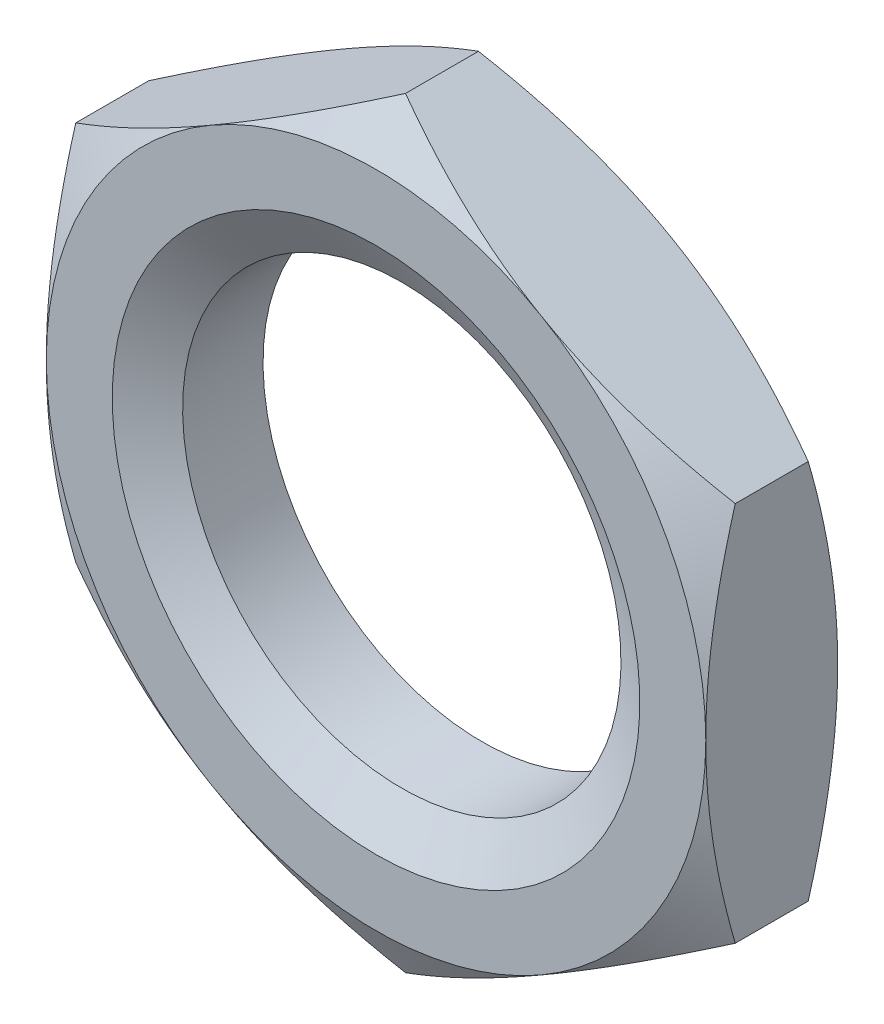
ISO-10303-21;
HEADER;
FILE_DESCRIPTION(('STEP AP214'),'2;1');
FILE_NAME('part.step','',(''),(''),'','','');
FILE_SCHEMA(('AUTOMOTIVE_DESIGN { 1 0 10303 214 1 1 1 1 }'));
ENDSEC;
DATA;
#1=APPLICATION_CONTEXT('core data for automotive mechanical design processes');
#2=APPLICATION_PROTOCOL_DEFINITION('international standard','automotive_design',2000,#1);
#3=PRODUCT_CONTEXT('',#1,'mechanical');
#4=PRODUCT('Part','Part','',(#3));
#5=PRODUCT_RELATED_PRODUCT_CATEGORY('part','',(#4));
#6=PRODUCT_DEFINITION_FORMATION('','',#4);
#7=PRODUCT_DEFINITION_CONTEXT('part definition',#1,'design');
#8=PRODUCT_DEFINITION('design','',#6,#7);
#9=PRODUCT_DEFINITION_SHAPE('','',#8);
#10=(LENGTH_UNIT() NAMED_UNIT(*) SI_UNIT(.MILLI.,.METRE.));
#11=(NAMED_UNIT(*) PLANE_ANGLE_UNIT() SI_UNIT($,.RADIAN.));
#12=(NAMED_UNIT(*) SI_UNIT($,.STERADIAN.) SOLID_ANGLE_UNIT());
#13=UNCERTAINTY_MEASURE_WITH_UNIT(LENGTH_MEASURE(1.E-05),#10,'distance_accuracy_value','');
#14=(GEOMETRIC_REPRESENTATION_CONTEXT(3) GLOBAL_UNCERTAINTY_ASSIGNED_CONTEXT((#13)) GLOBAL_UNIT_ASSIGNED_CONTEXT((#10,
#11,#12)) REPRESENTATION_CONTEXT('',''));
#15=CARTESIAN_POINT('',(0.,0.,0.));
#16=DIRECTION('',(0.,0.,1.));
#17=DIRECTION('',(1.,0.,0.));
#18=AXIS2_PLACEMENT_3D('',#15,#16,#17);
#19=CARTESIAN_POINT('',(5.,-2.88675134594813,2.));
#20=DIRECTION('',(-1.,0.,0.));
#21=DIRECTION('',(0.,-1.,0.));
#22=AXIS2_PLACEMENT_3D('',#19,#20,#21);
#23=PLANE('',#22);
#24=DIRECTION('',(0.,0.,-1.));
#25=VECTOR('',#24,1.);
#26=CARTESIAN_POINT('',(5.,2.88675134594813,2.));
#27=LINE('',#26,#25);
#28=CARTESIAN_POINT('',(5.,2.88675134594813,1.5534180126148));
#29=VERTEX_POINT('',#28);
#30=CARTESIAN_POINT('',(5.,2.88675134594813,0.446581987385198));
#31=VERTEX_POINT('',#30);
#32=EDGE_CURVE('E331',#29,#31,#27,.T.);
#33=ORIENTED_EDGE('',*,*,#32,.F.);
#34=CARTESIAN_POINT('',(5.,8.67769989901018,-0.895476469732144));
#35=CARTESIAN_POINT('',(5.,8.46999549957049,-0.79158832169301));
#36=CARTESIAN_POINT('',(5.,8.2619285715203,-0.688417367783481));
#37=CARTESIAN_POINT('',(5.,7.84490442766507,-0.483856435387872));
#38=CARTESIAN_POINT('',(5.,7.63594715329879,-0.382466576369758));
#39=CARTESIAN_POINT('',(5.,7.21658246207121,-0.181626132997501));
#40=CARTESIAN_POINT('',(5.,7.00617297083904,-0.082179870834344));
#41=CARTESIAN_POINT('',(5.,6.58413282248086,0.114080853981322));
#42=CARTESIAN_POINT('',(5.,6.3725021893705,0.210895368178843));
#43=CARTESIAN_POINT('',(5.,5.93822918094829,0.405568693651165));
#44=CARTESIAN_POINT('',(5.,5.71551978557234,0.503278490612934));
#45=CARTESIAN_POINT('',(5.,5.26820250921389,0.694246988771232));
#46=CARTESIAN_POINT('',(5.,5.04359469474663,0.787505845161429));
#47=CARTESIAN_POINT('',(5.,4.59223463012098,0.968324557950789));
#48=CARTESIAN_POINT('',(5.,4.36548370425789,1.05588769993605));
#49=CARTESIAN_POINT('',(5.,3.90933222338447,1.22378244712703));
#50=CARTESIAN_POINT('',(5.,3.67993196180089,1.30411484466863));
#51=CARTESIAN_POINT('',(5.,3.16390484606841,1.47329194440609));
#52=CARTESIAN_POINT('',(5.,2.87647211871412,1.55971587119509));
#53=CARTESIAN_POINT('',(5.,2.29642431473559,1.71355971006832));
#54=CARTESIAN_POINT('',(5.,2.00380970634483,1.78098132997756));
#55=CARTESIAN_POINT('',(5.,1.56391876076113,1.86312218276578));
#56=CARTESIAN_POINT('',(5.,1.4183757796473,1.8872097352011));
#57=CARTESIAN_POINT('',(5.,1.12635842901192,1.92878586653768));
#58=CARTESIAN_POINT('',(5.,0.979884197201779,1.94627539907545));
#59=CARTESIAN_POINT('',(5.,0.686297290424526,1.97413236405401));
#60=CARTESIAN_POINT('',(5.,0.539184811603695,1.98450184744371));
#61=CARTESIAN_POINT('',(5.,0.244620623595959,1.99779052304872));
#62=CARTESIAN_POINT('',(5.,0.0971689158377103,2.00070974658335));
#63=CARTESIAN_POINT('',(5.,-0.19857340257581,1.99899344261344));
#64=CARTESIAN_POINT('',(5.,-0.346863749180946,1.99431256971376));
#65=CARTESIAN_POINT('',(5.,-0.643014838668088,1.97747027318881));
#66=CARTESIAN_POINT('',(5.,-0.790875579638552,1.96530881632949));
#67=CARTESIAN_POINT('',(5.,-1.08589204232106,1.93389230888484));
#68=CARTESIAN_POINT('',(5.,-1.23304747583121,1.91463457364898));
#69=CARTESIAN_POINT('',(5.,-1.52634780050893,1.86959263924468));
#70=CARTESIAN_POINT('',(5.,-1.67249265612571,1.84380821166373));
#71=CARTESIAN_POINT('',(5.,-2.11408994754179,1.75668256988163));
#72=CARTESIAN_POINT('',(5.,-2.40773999823976,1.68613563774429));
#73=CARTESIAN_POINT('',(5.,-2.98996510032811,1.52649261863848));
#74=CARTESIAN_POINT('',(5.,-3.27853719879026,1.43738610188607));
#75=CARTESIAN_POINT('',(5.,-3.79024179461196,1.26587062387848));
#76=CARTESIAN_POINT('',(5.,-4.01425747334153,1.18605773283769));
#77=CARTESIAN_POINT('',(5.,-4.45972536136052,1.01978602799213));
#78=CARTESIAN_POINT('',(5.,-4.68117825700167,0.933329043298263));
#79=CARTESIAN_POINT('',(5.,-5.12210633953822,0.75511770374832));
#80=CARTESIAN_POINT('',(5.,-5.34158006915493,0.663359763856228));
#81=CARTESIAN_POINT('',(5.,-5.77874375147831,0.475684792649896));
#82=CARTESIAN_POINT('',(5.,-5.99643364762893,0.379767630070323));
#83=CARTESIAN_POINT('',(5.,-6.42115057108049,0.18872983291713));
#84=CARTESIAN_POINT('',(5.,-6.62823962150206,0.093746662021358));
#85=CARTESIAN_POINT('',(5.,-7.04125269120468,-0.0987070410129298));
#86=CARTESIAN_POINT('',(5.,-7.24717672850446,-0.196177534551979));
#87=CARTESIAN_POINT('',(5.,-7.65767872257996,-0.392988607314703));
#88=CARTESIAN_POINT('',(5.,-7.86225841752673,-0.492325568435463));
#89=CARTESIAN_POINT('',(5.,-8.27057470184742,-0.692704251624259));
#90=CARTESIAN_POINT('',(5.,-8.47431131456183,-0.793745926099248));
#91=CARTESIAN_POINT('',(5.,-8.67769989901018,-0.895476469732146));
#92=B_SPLINE_CURVE_WITH_KNOTS('',3,(#34,#35,#36,#37,#38,#39,#40,#41,#42,#43,#44,#45,#46,#47,#48,
#49,#50,#51,#52,#53,#54,#55,#56,#57,#58,#59,#60,#61,#62,#63,#64,#65,#66,#67,#68,#69,#70,#71,#72,
#73,#74,#75,#76,#77,#78,#79,#80,#81,#82,#83,#84,#85,#86,#87,#88,#89,#90,#91),.UNSPECIFIED.,.F.,
.F.,(4,2,2,2,2,2,2,2,2,2,2,2,2,2,2,2,2,2,2,2,2,2,2,2,2,2,2,2,4),(0.,0.69671365657365,
1.39347386853974,2.09163890900885,2.78979026545805,3.51935463562381,4.24889354901042,
4.9780078241473,5.70704210634685,6.60702023363349,7.50691744992126,7.94935972093775,
8.39173801959497,8.83398883650021,9.27623779427299,9.72113510626027,10.1660343948096,
10.6111021699031,11.0561855230418,11.9612951407397,12.8669147747757,13.58021856303,
14.2933266782871,15.0069228464768,15.720541552222,16.4040197454066,17.0874873384909,
17.7697443652452,18.4519823758207),.UNSPECIFIED.);
#93=CARTESIAN_POINT('',(5.,0.,2.));
#94=VERTEX_POINT('',#93);
#95=EDGE_CURVE('E12',#29,#94,#92,.T.);
#96=ORIENTED_EDGE('',*,*,#95,.T.);
#97=CARTESIAN_POINT('',(5.,-2.88675134594813,1.5534180126148));
#98=VERTEX_POINT('',#97);
#99=EDGE_CURVE('E43',#94,#98,#92,.T.);
#100=ORIENTED_EDGE('',*,*,#99,.T.);
#101=DIRECTION('',(0.,0.,-1.));
#102=VECTOR('',#101,1.);
#103=CARTESIAN_POINT('',(5.,-2.88675134594813,2.));
#104=LINE('',#103,#102);
#105=CARTESIAN_POINT('',(5.,-2.88675134594813,0.446581987385197));
#106=VERTEX_POINT('',#105);
#107=EDGE_CURVE('E332',#98,#106,#104,.T.);
#108=ORIENTED_EDGE('',*,*,#107,.T.);
#109=CARTESIAN_POINT('',(5.,-8.67769989901018,2.89547646973214));
#110=CARTESIAN_POINT('',(5.,-8.46999549957049,2.79158832169301));
#111=CARTESIAN_POINT('',(5.,-8.26192857152029,2.68841736778348));
#112=CARTESIAN_POINT('',(5.,-7.84490442766507,2.48385643538787));
#113=CARTESIAN_POINT('',(5.,-7.63594715329879,2.38246657636976));
#114=CARTESIAN_POINT('',(5.,-7.21658246207121,2.1816261329975));
#115=CARTESIAN_POINT('',(5.,-7.00617297083904,2.08217987083434));
#116=CARTESIAN_POINT('',(5.,-6.58413282248085,1.88591914601868));
#117=CARTESIAN_POINT('',(5.,-6.37250218937049,1.78910463182116));
#118=CARTESIAN_POINT('',(5.,-5.93822918094829,1.59443130634883));
#119=CARTESIAN_POINT('',(5.,-5.71551978557234,1.49672150938706));
#120=CARTESIAN_POINT('',(5.,-5.26820250921388,1.30575301122877));
#121=CARTESIAN_POINT('',(5.,-5.04359469474663,1.21249415483857));
#122=CARTESIAN_POINT('',(5.,-4.59223463012097,1.03167544204921));
#123=CARTESIAN_POINT('',(5.,-4.36548370425789,0.944112300063951));
#124=CARTESIAN_POINT('',(5.,-3.90933222338447,0.776217552872965));
#125=CARTESIAN_POINT('',(5.,-3.67993196180088,0.695885155331364));
#126=CARTESIAN_POINT('',(5.,-3.1639048460684,0.526708055593903));
#127=CARTESIAN_POINT('',(5.,-2.87647211871411,0.440284128804903));
#128=CARTESIAN_POINT('',(5.,-2.29642431473558,0.286440289931674));
#129=CARTESIAN_POINT('',(5.,-2.00380970634482,0.21901867002244));
#130=CARTESIAN_POINT('',(5.,-1.56391876076112,0.13687781723422));
#131=CARTESIAN_POINT('',(5.,-1.41837577964728,0.112790264798898));
#132=CARTESIAN_POINT('',(5.,-1.12635842901191,0.0712141334623172));
#133=CARTESIAN_POINT('',(5.,-0.979884197201768,0.0537246009245482));
#134=CARTESIAN_POINT('',(5.,-0.686297290424514,0.0258676359459865));
#135=CARTESIAN_POINT('',(5.,-0.539184811603682,0.0154981525562886));
#136=CARTESIAN_POINT('',(5.,-0.244620623595947,0.00220947695128381));
#137=CARTESIAN_POINT('',(5.,-0.097168915837698,-0.000709746583348257));
#138=CARTESIAN_POINT('',(5.,0.198573402575823,0.00100655738656429));
#139=CARTESIAN_POINT('',(5.,0.346863749180959,0.00568743028623774));
#140=CARTESIAN_POINT('',(5.,0.643014838668102,0.0225297268111923));
#141=CARTESIAN_POINT('',(5.,0.790875579638565,0.0346911836705058));
#142=CARTESIAN_POINT('',(5.,1.08589204232107,0.0661076911151592));
#143=CARTESIAN_POINT('',(5.,1.23304747583122,0.0853654263510177));
#144=CARTESIAN_POINT('',(5.,1.52634780050894,0.130407360755316));
#145=CARTESIAN_POINT('',(5.,1.67249265612572,0.156191788336271));
#146=CARTESIAN_POINT('',(5.,2.1140899475418,0.243317430118368));
#147=CARTESIAN_POINT('',(5.,2.40773999823977,0.31386436225571));
#148=CARTESIAN_POINT('',(5.,2.98996510032812,0.473507381361524));
#149=CARTESIAN_POINT('',(5.,3.27853719879027,0.562613898113936));
#150=CARTESIAN_POINT('',(5.,3.79024179461197,0.734129376121524));
#151=CARTESIAN_POINT('',(5.,4.01425747334154,0.813942267162311));
#152=CARTESIAN_POINT('',(5.,4.45972536136054,0.980213972007867));
#153=CARTESIAN_POINT('',(5.,4.68117825700168,1.06667095670174));
#154=CARTESIAN_POINT('',(5.,5.12210633953823,1.24488229625168));
#155=CARTESIAN_POINT('',(5.,5.34158006915494,1.33664023614377));
#156=CARTESIAN_POINT('',(5.,5.77874375147832,1.5243152073501));
#157=CARTESIAN_POINT('',(5.,5.99643364762893,1.62023236992968));
#158=CARTESIAN_POINT('',(5.,6.42115057108049,1.81127016708287));
#159=CARTESIAN_POINT('',(5.,6.62823962150206,1.90625333797864));
#160=CARTESIAN_POINT('',(5.,7.04125269120469,2.09870704101293));
#161=CARTESIAN_POINT('',(5.,7.24717672850447,2.19617753455198));
#162=CARTESIAN_POINT('',(5.,7.65767872257996,2.3929886073147));
#163=CARTESIAN_POINT('',(5.,7.86225841752673,2.49232556843546));
#164=CARTESIAN_POINT('',(5.,8.27057470184742,2.69270425162426));
#165=CARTESIAN_POINT('',(5.,8.47431131456183,2.79374592609924));
#166=CARTESIAN_POINT('',(5.,8.67769989901018,2.89547646973214));
#167=B_SPLINE_CURVE_WITH_KNOTS('',3,(#109,#110,#111,#112,#113,#114,#115,#116,#117,#118,#119,
#120,#121,#122,#123,#124,#125,#126,#127,#128,#129,#130,#131,#132,#133,#134,#135,#136,#137,#138,
#139,#140,#141,#142,#143,#144,#145,#146,#147,#148,#149,#150,#151,#152,#153,#154,#155,#156,#157,
#158,#159,#160,#161,#162,#163,#164,#165,#166),.UNSPECIFIED.,.F.,.F.,(4,2,2,2,2,2,2,2,2,2,2,2,2,
2,2,2,2,2,2,2,2,2,2,2,2,2,2,2,4),(0.,0.696713656573649,1.39347386853974,2.09163890900885,
2.78979026545805,3.51935463562382,4.24889354901043,4.97800782414731,5.70704210634685,
6.6070202336335,7.50691744992127,7.94935972093776,8.39173801959498,8.83398883650022,
9.276237794273,9.72113510626028,10.1660343948096,10.6111021699031,11.0561855230418,
11.9612951407398,12.8669147747757,13.58021856303,14.2933266782871,15.0069228464768,
15.720541552222,16.4040197454066,17.0874873384909,17.7697443652452,18.4519823758207),.UNSPECIFIED.);
#168=CARTESIAN_POINT('',(5.,0.,0.));
#169=VERTEX_POINT('',#168);
#170=EDGE_CURVE('E155',#106,#169,#167,.T.);
#171=ORIENTED_EDGE('',*,*,#170,.T.);
#172=EDGE_CURVE('E200',#169,#31,#167,.T.);
#173=ORIENTED_EDGE('',*,*,#172,.T.);
#174=EDGE_LOOP('',(#33,#96,#100,#108,#171,#173));
#175=FACE_BOUND('',#174,.T.);
#176=ADVANCED_FACE('F38',(#175),#23,.F.);
#177=CARTESIAN_POINT('',(0.,-5.77350269189626,2.));
#178=DIRECTION('',(-0.5,0.866025403784439,0.));
#179=DIRECTION('',(-0.866025403784439,-0.5,0.));
#180=AXIS2_PLACEMENT_3D('',#177,#178,#179);
#181=PLANE('',#180);
#182=ORIENTED_EDGE('',*,*,#107,.F.);
#183=CARTESIAN_POINT('',(5.0002,-2.88663587589429,1.55335134394817));
#184=CARTESIAN_POINT('',(4.78046540547482,-3.01349970319368,1.62661343236237));
#185=CARTESIAN_POINT('',(4.55885141554042,-3.14144859993849,1.69324867808191));
#186=CARTESIAN_POINT('',(4.11178600454649,-3.39956193532121,1.80956100898919));
#187=CARTESIAN_POINT('',(3.88632664040923,-3.52973095989718,1.85919695008421));
#188=CARTESIAN_POINT('',(3.43816769477649,-3.78847564779797,1.9364489745813));
#189=CARTESIAN_POINT('',(3.21553790689581,-3.91701101576052,1.96457962171651));
#190=CARTESIAN_POINT('',(2.88081009815336,-4.11026620624322,1.98980507804632));
#191=CARTESIAN_POINT('',(2.76915780319494,-4.17472868879311,1.99538654023052));
#192=CARTESIAN_POINT('',(2.5457500293262,-4.30371322717528,2.00079778324853));
#193=CARTESIAN_POINT('',(2.43399455370969,-4.36823528110589,2.0006277417418));
#194=CARTESIAN_POINT('',(2.12781576914936,-4.54500768479194,1.99224636820796));
#195=CARTESIAN_POINT('',(1.93349391403279,-4.65719946015292,1.97817022810275));
#196=CARTESIAN_POINT('',(1.5461398980023,-4.88083840557981,1.93353474289057));
#197=CARTESIAN_POINT('',(1.35310909862843,-4.9922847895602,1.90296013985249));
#198=CARTESIAN_POINT('',(0.964974657525146,-5.21637431361295,1.82653150637884));
#199=CARTESIAN_POINT('',(0.769920001358265,-5.32898917185759,1.78035362112132));
#200=CARTESIAN_POINT('',(0.382719654641233,-5.55253939626498,1.67554820550807));
#201=CARTESIAN_POINT('',(0.190569004591914,-5.66347762579592,1.61694529656263));
#202=CARTESIAN_POINT('',(-0.000199999999999114,-5.77361816195009,1.55335134394817));
#203=B_SPLINE_CURVE_WITH_KNOTS('',3,(#183,#184,#185,#186,#187,#188,#189,#190,#191,#192,#193,
#194,#195,#196,#197,#198,#199,#200,#201,#202),.UNSPECIFIED.,.F.,.F.,(4,2,2,2,2,2,2,2,2,4),(0.,
0.79255584136309,1.58701660053333,2.3618153748728,2.74884076077325,3.13585419177295,
3.80962362599679,4.48401723901189,5.17336882348928,5.86136694793725),.UNSPECIFIED.);
#204=CARTESIAN_POINT('',(2.5,-4.33012701892219,2.));
#205=VERTEX_POINT('',#204);
#206=EDGE_CURVE('E272',#98,#205,#203,.T.);
#207=ORIENTED_EDGE('',*,*,#206,.T.);
#208=CARTESIAN_POINT('',(0.,-5.77350269189626,1.5534180126148));
#209=VERTEX_POINT('',#208);
#210=EDGE_CURVE('E289',#205,#209,#203,.T.);
#211=ORIENTED_EDGE('',*,*,#210,.T.);
#212=DIRECTION('',(0.,0.,-1.));
#213=VECTOR('',#212,1.);
#214=CARTESIAN_POINT('',(0.,-5.77350269189626,2.));
#215=LINE('',#214,#213);
#216=CARTESIAN_POINT('',(0.,-5.77350269189626,0.446581987385197));
#217=VERTEX_POINT('',#216);
#218=EDGE_CURVE('E165',#209,#217,#215,.T.);
#219=ORIENTED_EDGE('',*,*,#218,.T.);
#220=CARTESIAN_POINT('',(-0.000199999999999318,-5.77361816195009,0.446648656051823));
#221=CARTESIAN_POINT('',(0.219534594525186,-5.6467543346507,0.373386567637629));
#222=CARTESIAN_POINT('',(0.441148584459581,-5.51880543790589,0.306751321918087));
#223=CARTESIAN_POINT('',(0.888213995453514,-5.26069210252318,0.190438991010807));
#224=CARTESIAN_POINT('',(1.11367335959077,-5.13052307794721,0.140803049915786));
#225=CARTESIAN_POINT('',(1.56183230522351,-4.87177839004641,0.0635510254186957));
#226=CARTESIAN_POINT('',(1.78446209310419,-4.74324302208387,0.0354203782834873));
#227=CARTESIAN_POINT('',(2.11918990184664,-4.54998783160116,0.0101949219536826));
#228=CARTESIAN_POINT('',(2.23084219680506,-4.48552534905128,0.00461345976948215));
#229=CARTESIAN_POINT('',(2.4542499706738,-4.35654081066911,-0.000797783248531316));
#230=CARTESIAN_POINT('',(2.56600544629031,-4.2920187567385,-0.000627741741797939));
#231=CARTESIAN_POINT('',(2.87218423085064,-4.11524635305244,0.00775363179203551));
#232=CARTESIAN_POINT('',(3.06650608596721,-4.00305457769146,0.0218297718972504));
#233=CARTESIAN_POINT('',(3.45386010199771,-3.77941563226457,0.0664652571094293));
#234=CARTESIAN_POINT('',(3.64689090137157,-3.66796924828418,0.0970398601475061));
#235=CARTESIAN_POINT('',(4.03502534247485,-3.44387972423144,0.173468493621161));
#236=CARTESIAN_POINT('',(4.23007999864174,-3.3312648659868,0.219646378878678));
#237=CARTESIAN_POINT('',(4.61728034535877,-3.1077146415794,0.324451794491931));
#238=CARTESIAN_POINT('',(4.80943099540809,-2.99677641204847,0.383054703437371));
#239=CARTESIAN_POINT('',(5.0002,-2.88663587589429,0.446648656051824));
#240=B_SPLINE_CURVE_WITH_KNOTS('',3,(#220,#221,#222,#223,#224,#225,#226,#227,#228,#229,#230,
#231,#232,#233,#234,#235,#236,#237,#238,#239),.UNSPECIFIED.,.F.,.F.,(4,2,2,2,2,2,2,2,2,4),(0.,
0.79255584136309,1.58701660053333,2.3618153748728,2.74884076077325,3.13585419177295,
3.80962362599679,4.48401723901189,5.17336882348928,5.86136694793725),.UNSPECIFIED.);
#241=CARTESIAN_POINT('',(2.5,-4.33012701892219,0.));
#242=VERTEX_POINT('',#241);
#243=EDGE_CURVE('E139',#217,#242,#240,.T.);
#244=ORIENTED_EDGE('',*,*,#243,.T.);
#245=EDGE_CURVE('E152',#242,#106,#240,.T.);
#246=ORIENTED_EDGE('',*,*,#245,.T.);
#247=EDGE_LOOP('',(#182,#207,#211,#219,#244,#246));
#248=FACE_BOUND('',#247,.T.);
#249=ADVANCED_FACE('F162',(#248),#181,.F.);
#250=CARTESIAN_POINT('',(-5.,-2.88675134594813,2.));
#251=DIRECTION('',(0.5,0.866025403784439,0.));
#252=DIRECTION('',(-0.866025403784439,0.5,0.));
#253=AXIS2_PLACEMENT_3D('',#250,#251,#252);
#254=PLANE('',#253);
#255=ORIENTED_EDGE('',*,*,#218,.F.);
#256=CARTESIAN_POINT('',(0.000200000000000734,-5.77361816195009,1.55335134394817));
#257=CARTESIAN_POINT('',(-0.219534594525185,-5.6467543346507,1.62661343236237));
#258=CARTESIAN_POINT('',(-0.44114858445958,-5.51880543790589,1.69324867808191));
#259=CARTESIAN_POINT('',(-0.888213995453512,-5.26069210252318,1.80956100898919));
#260=CARTESIAN_POINT('',(-1.11367335959077,-5.13052307794721,1.85919695008421));
#261=CARTESIAN_POINT('',(-1.56183230522351,-4.87177839004641,1.9364489745813));
#262=CARTESIAN_POINT('',(-1.78446209310419,-4.74324302208387,1.96457962171651));
#263=CARTESIAN_POINT('',(-2.11918990184664,-4.54998783160116,1.98980507804632));
#264=CARTESIAN_POINT('',(-2.23084219680506,-4.48552534905128,1.99538654023052));
#265=CARTESIAN_POINT('',(-2.4542499706738,-4.35654081066911,2.00079778324853));
#266=CARTESIAN_POINT('',(-2.56600544629031,-4.2920187567385,2.0006277417418));
#267=CARTESIAN_POINT('',(-2.87218423085064,-4.11524635305244,1.99224636820796));
#268=CARTESIAN_POINT('',(-3.06650608596721,-4.00305457769146,1.97817022810275));
#269=CARTESIAN_POINT('',(-3.4538601019977,-3.77941563226457,1.93353474289057));
#270=CARTESIAN_POINT('',(-3.64689090137157,-3.66796924828419,1.90296013985249));
#271=CARTESIAN_POINT('',(-4.03502534247485,-3.44387972423144,1.82653150637884));
#272=CARTESIAN_POINT('',(-4.23007999864173,-3.3312648659868,1.78035362112132));
#273=CARTESIAN_POINT('',(-4.61728034535877,-3.1077146415794,1.67554820550807));
#274=CARTESIAN_POINT('',(-4.80943099540809,-2.99677641204847,1.61694529656263));
#275=CARTESIAN_POINT('',(-5.0002,-2.88663587589429,1.55335134394817));
#276=B_SPLINE_CURVE_WITH_KNOTS('',3,(#256,#257,#258,#259,#260,#261,#262,#263,#264,#265,#266,
#267,#268,#269,#270,#271,#272,#273,#274,#275),.UNSPECIFIED.,.F.,.F.,(4,2,2,2,2,2,2,2,2,4),(0.,
0.79255584136309,1.58701660053333,2.3618153748728,2.74884076077325,3.13585419177295,
3.80962362599679,4.48401723901189,5.17336882348928,5.86136694793725),.UNSPECIFIED.);
#277=CARTESIAN_POINT('',(-2.5,-4.33012701892219,2.));
#278=VERTEX_POINT('',#277);
#279=EDGE_CURVE('E248',#209,#278,#276,.T.);
#280=ORIENTED_EDGE('',*,*,#279,.T.);
#281=CARTESIAN_POINT('',(-5.,-2.88675134594813,1.5534180126148));
#282=VERTEX_POINT('',#281);
#283=EDGE_CURVE('E296',#278,#282,#276,.T.);
#284=ORIENTED_EDGE('',*,*,#283,.T.);
#285=DIRECTION('',(0.,0.,-1.));
#286=VECTOR('',#285,1.);
#287=CARTESIAN_POINT('',(-5.,-2.88675134594813,2.));
#288=LINE('',#287,#286);
#289=CARTESIAN_POINT('',(-5.,-2.88675134594813,0.446581987385197));
#290=VERTEX_POINT('',#289);
#291=EDGE_CURVE('E336',#282,#290,#288,.T.);
#292=ORIENTED_EDGE('',*,*,#291,.T.);
#293=CARTESIAN_POINT('',(-5.0002,-2.88663587589429,0.446648656051824));
#294=CARTESIAN_POINT('',(-4.78046540547481,-3.01349970319368,0.373386567637631));
#295=CARTESIAN_POINT('',(-4.55885141554042,-3.14144859993849,0.306751321918088));
#296=CARTESIAN_POINT('',(-4.11178600454649,-3.39956193532121,0.190438991010808));
#297=CARTESIAN_POINT('',(-3.88632664040923,-3.52973095989718,0.140803049915787));
#298=CARTESIAN_POINT('',(-3.43816769477649,-3.78847564779797,0.0635510254186962));
#299=CARTESIAN_POINT('',(-3.21553790689581,-3.91701101576052,0.0354203782834877));
#300=CARTESIAN_POINT('',(-2.88081009815336,-4.11026620624322,0.0101949219536831));
#301=CARTESIAN_POINT('',(-2.76915780319494,-4.17472868879311,0.00461345976948265));
#302=CARTESIAN_POINT('',(-2.5457500293262,-4.30371322717528,-0.00079778324853101));
#303=CARTESIAN_POINT('',(-2.43399455370969,-4.36823528110589,-0.000627741741797893));
#304=CARTESIAN_POINT('',(-2.12781576914936,-4.54500768479194,0.00775363179203513));
#305=CARTESIAN_POINT('',(-1.93349391403279,-4.65719946015292,0.02182977189725));
#306=CARTESIAN_POINT('',(-1.5461398980023,-4.88083840557981,0.0664652571094285));
#307=CARTESIAN_POINT('',(-1.35310909862843,-4.9922847895602,0.097039860147505));
#308=CARTESIAN_POINT('',(-0.964974657525146,-5.21637431361295,0.17346849362116));
#309=CARTESIAN_POINT('',(-0.769920001358265,-5.32898917185759,0.219646378878676));
#310=CARTESIAN_POINT('',(-0.382719654641233,-5.55253939626498,0.32445179449193));
#311=CARTESIAN_POINT('',(-0.190569004591914,-5.66347762579591,0.383054703437369));
#312=CARTESIAN_POINT('',(0.000199999999999789,-5.77361816195009,0.446648656051822));
#313=B_SPLINE_CURVE_WITH_KNOTS('',3,(#293,#294,#295,#296,#297,#298,#299,#300,#301,#302,#303,
#304,#305,#306,#307,#308,#309,#310,#311,#312),.UNSPECIFIED.,.F.,.F.,(4,2,2,2,2,2,2,2,2,4),(0.,
0.79255584136309,1.58701660053333,2.3618153748728,2.74884076077325,3.13585419177295,
3.80962362599679,4.48401723901189,5.17336882348928,5.86136694793725),.UNSPECIFIED.);
#314=CARTESIAN_POINT('',(-2.5,-4.33012701892219,0.));
#315=VERTEX_POINT('',#314);
#316=EDGE_CURVE('E384',#290,#315,#313,.T.);
#317=ORIENTED_EDGE('',*,*,#316,.T.);
#318=EDGE_CURVE('E141',#315,#217,#313,.T.);
#319=ORIENTED_EDGE('',*,*,#318,.T.);
#320=EDGE_LOOP('',(#255,#280,#284,#292,#317,#319));
#321=FACE_BOUND('',#320,.T.);
#322=ADVANCED_FACE('F354',(#321),#254,.F.);
#323=CARTESIAN_POINT('',(-5.,2.88675134594813,2.));
#324=DIRECTION('',(1.,0.,0.));
#325=DIRECTION('',(0.,1.,0.));
#326=AXIS2_PLACEMENT_3D('',#323,#324,#325);
#327=PLANE('',#326);
#328=ORIENTED_EDGE('',*,*,#291,.F.);
#329=CARTESIAN_POINT('',(-5.,-8.67769989901018,-0.895476469732145));
#330=CARTESIAN_POINT('',(-5.,-8.46999549957049,-0.791588321693009));
#331=CARTESIAN_POINT('',(-5.,-8.26192857152029,-0.688417367783481));
#332=CARTESIAN_POINT('',(-5.,-7.84490442766506,-0.483856435387872));
#333=CARTESIAN_POINT('',(-5.,-7.63594715329879,-0.382466576369758));
#334=CARTESIAN_POINT('',(-5.,-7.2165824620712,-0.181626132997501));
#335=CARTESIAN_POINT('',(-5.,-7.00617297083904,-0.0821798708343445));
#336=CARTESIAN_POINT('',(-5.,-6.58413282248085,0.114080853981321));
#337=CARTESIAN_POINT('',(-5.,-6.37250218937049,0.210895368178842));
#338=CARTESIAN_POINT('',(-5.,-5.93822918094829,0.405568693651164));
#339=CARTESIAN_POINT('',(-5.,-5.71551978557234,0.503278490612933));
#340=CARTESIAN_POINT('',(-5.,-5.26820250921389,0.694246988771232));
#341=CARTESIAN_POINT('',(-5.,-5.04359469474663,0.787505845161428));
#342=CARTESIAN_POINT('',(-5.,-4.59223463012097,0.968324557950789));
#343=CARTESIAN_POINT('',(-5.,-4.36548370425789,1.05588769993605));
#344=CARTESIAN_POINT('',(-5.,-3.90933222338447,1.22378244712703));
#345=CARTESIAN_POINT('',(-5.,-3.67993196180089,1.30411484466863));
#346=CARTESIAN_POINT('',(-5.,-3.1639048460684,1.47329194440609));
#347=CARTESIAN_POINT('',(-5.,-2.87647211871411,1.55971587119509));
#348=CARTESIAN_POINT('',(-5.,-2.29642431473558,1.71355971006832));
#349=CARTESIAN_POINT('',(-5.,-2.00380970634482,1.78098132997756));
#350=CARTESIAN_POINT('',(-5.,-1.56391876076113,1.86312218276578));
#351=CARTESIAN_POINT('',(-5.,-1.41837577964729,1.8872097352011));
#352=CARTESIAN_POINT('',(-5.,-1.12635842901192,1.92878586653768));
#353=CARTESIAN_POINT('',(-5.,-0.979884197201775,1.94627539907545));
#354=CARTESIAN_POINT('',(-5.,-0.686297290424522,1.97413236405401));
#355=CARTESIAN_POINT('',(-5.,-0.539184811603691,1.98450184744371));
#356=CARTESIAN_POINT('',(-5.,-0.244620623595955,1.99779052304871));
#357=CARTESIAN_POINT('',(-5.,-0.0971689158377062,2.00070974658335));
#358=CARTESIAN_POINT('',(-5.,0.198573402575814,1.99899344261343));
#359=CARTESIAN_POINT('',(-5.,0.34686374918095,1.99431256971376));
#360=CARTESIAN_POINT('',(-5.,0.643014838668092,1.97747027318881));
#361=CARTESIAN_POINT('',(-5.,0.790875579638556,1.96530881632949));
#362=CARTESIAN_POINT('',(-5.,1.08589204232106,1.93389230888484));
#363=CARTESIAN_POINT('',(-5.,1.23304747583121,1.91463457364898));
#364=CARTESIAN_POINT('',(-5.,1.52634780050893,1.86959263924468));
#365=CARTESIAN_POINT('',(-5.,1.67249265612571,1.84380821166373));
#366=CARTESIAN_POINT('',(-5.,2.11408994754179,1.75668256988163));
#367=CARTESIAN_POINT('',(-5.,2.40773999823976,1.68613563774429));
#368=CARTESIAN_POINT('',(-5.,2.98996510032811,1.52649261863848));
#369=CARTESIAN_POINT('',(-5.,3.27853719879026,1.43738610188606));
#370=CARTESIAN_POINT('',(-5.,3.79024179461196,1.26587062387848));
#371=CARTESIAN_POINT('',(-5.,4.01425747334153,1.18605773283769));
#372=CARTESIAN_POINT('',(-5.,4.45972536136053,1.01978602799213));
#373=CARTESIAN_POINT('',(-5.,4.68117825700167,0.933329043298264));
#374=CARTESIAN_POINT('',(-5.,5.12210633953823,0.755117703748321));
#375=CARTESIAN_POINT('',(-5.,5.34158006915493,0.663359763856228));
#376=CARTESIAN_POINT('',(-5.,5.77874375147831,0.475684792649897));
#377=CARTESIAN_POINT('',(-5.,5.99643364762893,0.379767630070324));
#378=CARTESIAN_POINT('',(-5.,6.42115057108049,0.188729832917131));
#379=CARTESIAN_POINT('',(-5.,6.62823962150206,0.0937466620213591));
#380=CARTESIAN_POINT('',(-5.,7.04125269120468,-0.0987070410129277));
#381=CARTESIAN_POINT('',(-5.,7.24717672850446,-0.196177534551976));
#382=CARTESIAN_POINT('',(-5.,7.65767872257996,-0.3929886073147));
#383=CARTESIAN_POINT('',(-5.,7.86225841752672,-0.49232556843546));
#384=CARTESIAN_POINT('',(-5.,8.27057470184742,-0.692704251624256));
#385=CARTESIAN_POINT('',(-5.,8.47431131456183,-0.793745926099246));
#386=CARTESIAN_POINT('',(-5.,8.67769989901018,-0.895476469732144));
#387=B_SPLINE_CURVE_WITH_KNOTS('',3,(#329,#330,#331,#332,#333,#334,#335,#336,#337,#338,#339,
#340,#341,#342,#343,#344,#345,#346,#347,#348,#349,#350,#351,#352,#353,#354,#355,#356,#357,#358,
#359,#360,#361,#362,#363,#364,#365,#366,#367,#368,#369,#370,#371,#372,#373,#374,#375,#376,#377,
#378,#379,#380,#381,#382,#383,#384,#385,#386),.UNSPECIFIED.,.F.,.F.,(4,2,2,2,2,2,2,2,2,2,2,2,2,
2,2,2,2,2,2,2,2,2,2,2,2,2,2,2,4),(0.,0.69671365657365,1.39347386853974,2.09163890900885,
2.78979026545805,3.51935463562381,4.24889354901042,4.9780078241473,5.70704210634685,
6.60702023363349,7.50691744992126,7.94935972093775,8.39173801959497,8.83398883650021,
9.27623779427299,9.72113510626027,10.1660343948096,10.6111021699031,11.0561855230418,
11.9612951407397,12.8669147747757,13.58021856303,14.2933266782871,15.0069228464768,
15.720541552222,16.4040197454066,17.0874873384909,17.7697443652452,18.4519823758207),.UNSPECIFIED.);
#388=CARTESIAN_POINT('',(-5.,0.,2.));
#389=VERTEX_POINT('',#388);
#390=EDGE_CURVE('E302',#282,#389,#387,.T.);
#391=ORIENTED_EDGE('',*,*,#390,.T.);
#392=CARTESIAN_POINT('',(-5.,2.88675134594812,1.5534180126148));
#393=VERTEX_POINT('',#392);
#394=EDGE_CURVE('E254',#389,#393,#387,.T.);
#395=ORIENTED_EDGE('',*,*,#394,.T.);
#396=DIRECTION('',(0.,0.,-1.));
#397=VECTOR('',#396,1.);
#398=CARTESIAN_POINT('',(-5.,2.88675134594813,2.));
#399=LINE('',#398,#397);
#400=CARTESIAN_POINT('',(-5.,2.88675134594812,0.446581987385198));
#401=VERTEX_POINT('',#400);
#402=EDGE_CURVE('E309',#393,#401,#399,.T.);
#403=ORIENTED_EDGE('',*,*,#402,.T.);
#404=CARTESIAN_POINT('',(-5.,8.67769989901018,2.89547646973214));
#405=CARTESIAN_POINT('',(-5.,8.46999549957049,2.79158832169301));
#406=CARTESIAN_POINT('',(-5.,8.26192857152029,2.68841736778348));
#407=CARTESIAN_POINT('',(-5.,7.84490442766506,2.48385643538787));
#408=CARTESIAN_POINT('',(-5.,7.63594715329878,2.38246657636976));
#409=CARTESIAN_POINT('',(-5.,7.2165824620712,2.1816261329975));
#410=CARTESIAN_POINT('',(-5.,7.00617297083903,2.08217987083434));
#411=CARTESIAN_POINT('',(-5.,6.58413282248085,1.88591914601868));
#412=CARTESIAN_POINT('',(-5.,6.37250218937049,1.78910463182116));
#413=CARTESIAN_POINT('',(-5.,5.93822918094829,1.59443130634883));
#414=CARTESIAN_POINT('',(-5.,5.71551978557234,1.49672150938707));
#415=CARTESIAN_POINT('',(-5.,5.26820250921388,1.30575301122877));
#416=CARTESIAN_POINT('',(-5.,5.04359469474663,1.21249415483857));
#417=CARTESIAN_POINT('',(-5.,4.59223463012097,1.03167544204921));
#418=CARTESIAN_POINT('',(-5.,4.36548370425789,0.944112300063953));
#419=CARTESIAN_POINT('',(-5.,3.90933222338447,0.776217552872966));
#420=CARTESIAN_POINT('',(-5.,3.67993196180088,0.695885155331365));
#421=CARTESIAN_POINT('',(-5.,3.1639048460684,0.526708055593904));
#422=CARTESIAN_POINT('',(-5.,2.87647211871411,0.440284128804904));
#423=CARTESIAN_POINT('',(-5.,2.29642431473558,0.286440289931675));
#424=CARTESIAN_POINT('',(-5.,2.00380970634482,0.219018670022441));
#425=CARTESIAN_POINT('',(-5.,1.56391876076112,0.136877817234221));
#426=CARTESIAN_POINT('',(-5.,1.41837577964728,0.112790264798899));
#427=CARTESIAN_POINT('',(-5.,1.12635842901191,0.0712141334623183));
#428=CARTESIAN_POINT('',(-5.,0.979884197201768,0.0537246009245496));
#429=CARTESIAN_POINT('',(-5.,0.686297290424513,0.0258676359459879));
#430=CARTESIAN_POINT('',(-5.,0.539184811603682,0.0154981525562895));
#431=CARTESIAN_POINT('',(-5.,0.244620623595946,0.00220947695128463));
#432=CARTESIAN_POINT('',(-5.,0.0971689158376977,-0.000709746583346989));
#433=CARTESIAN_POINT('',(-5.,-0.198573402575823,0.00100655738656551));
#434=CARTESIAN_POINT('',(-5.,-0.346863749180959,0.00568743028623846));
#435=CARTESIAN_POINT('',(-5.,-0.643014838668102,0.022529726811193));
#436=CARTESIAN_POINT('',(-5.,-0.790875579638566,0.0346911836705069));
#437=CARTESIAN_POINT('',(-5.,-1.08589204232107,0.0661076911151604));
#438=CARTESIAN_POINT('',(-5.,-1.23304747583122,0.0853654263510185));
#439=CARTESIAN_POINT('',(-5.,-1.52634780050894,0.130407360755317));
#440=CARTESIAN_POINT('',(-5.,-1.67249265612572,0.156191788336271));
#441=CARTESIAN_POINT('',(-5.,-2.1140899475418,0.243317430118369));
#442=CARTESIAN_POINT('',(-5.,-2.40773999823977,0.313864362255711));
#443=CARTESIAN_POINT('',(-5.,-2.98996510032812,0.473507381361524));
#444=CARTESIAN_POINT('',(-5.,-3.27853719879027,0.562613898113935));
#445=CARTESIAN_POINT('',(-5.,-3.79024179461197,0.734129376121524));
#446=CARTESIAN_POINT('',(-5.,-4.01425747334154,0.813942267162311));
#447=CARTESIAN_POINT('',(-5.,-4.45972536136054,0.980213972007867));
#448=CARTESIAN_POINT('',(-5.,-4.68117825700168,1.06667095670174));
#449=CARTESIAN_POINT('',(-5.,-5.12210633953823,1.24488229625168));
#450=CARTESIAN_POINT('',(-5.,-5.34158006915494,1.33664023614377));
#451=CARTESIAN_POINT('',(-5.,-5.77874375147832,1.5243152073501));
#452=CARTESIAN_POINT('',(-5.,-5.99643364762893,1.62023236992967));
#453=CARTESIAN_POINT('',(-5.,-6.42115057108049,1.81127016708287));
#454=CARTESIAN_POINT('',(-5.,-6.62823962150206,1.90625333797864));
#455=CARTESIAN_POINT('',(-5.,-7.04125269120469,2.09870704101293));
#456=CARTESIAN_POINT('',(-5.,-7.24717672850446,2.19617753455198));
#457=CARTESIAN_POINT('',(-5.,-7.65767872257996,2.3929886073147));
#458=CARTESIAN_POINT('',(-5.,-7.86225841752673,2.49232556843546));
#459=CARTESIAN_POINT('',(-5.,-8.27057470184742,2.69270425162425));
#460=CARTESIAN_POINT('',(-5.,-8.47431131456183,2.79374592609924));
#461=CARTESIAN_POINT('',(-5.,-8.67769989901018,2.89547646973214));
#462=B_SPLINE_CURVE_WITH_KNOTS('',3,(#404,#405,#406,#407,#408,#409,#410,#411,#412,#413,#414,
#415,#416,#417,#418,#419,#420,#421,#422,#423,#424,#425,#426,#427,#428,#429,#430,#431,#432,#433,
#434,#435,#436,#437,#438,#439,#440,#441,#442,#443,#444,#445,#446,#447,#448,#449,#450,#451,#452,
#453,#454,#455,#456,#457,#458,#459,#460,#461),.UNSPECIFIED.,.F.,.F.,(4,2,2,2,2,2,2,2,2,2,2,2,2,
2,2,2,2,2,2,2,2,2,2,2,2,2,2,2,4),(0.,0.69671365657365,1.39347386853974,2.09163890900885,
2.78979026545805,3.51935463562381,4.24889354901042,4.97800782414731,5.70704210634685,
6.60702023363349,7.50691744992127,7.94935972093776,8.39173801959498,8.83398883650022,
9.276237794273,9.72113510626028,10.1660343948096,10.6111021699031,11.0561855230418,
11.9612951407398,12.8669147747757,13.58021856303,14.2933266782871,15.0069228464768,
15.720541552222,16.4040197454066,17.0874873384909,17.7697443652452,18.4519823758207),.UNSPECIFIED.);
#463=CARTESIAN_POINT('',(-5.,0.,0.));
#464=VERTEX_POINT('',#463);
#465=EDGE_CURVE('E224',#401,#464,#462,.T.);
#466=ORIENTED_EDGE('',*,*,#465,.T.);
#467=EDGE_CURVE('E210',#464,#290,#462,.T.);
#468=ORIENTED_EDGE('',*,*,#467,.T.);
#469=EDGE_LOOP('',(#328,#391,#395,#403,#466,#468));
#470=FACE_BOUND('',#469,.T.);
#471=ADVANCED_FACE('F234',(#470),#327,.F.);
#472=CARTESIAN_POINT('',(0.,5.77350269189626,2.));
#473=DIRECTION('',(0.5,-0.866025403784439,0.));
#474=DIRECTION('',(0.866025403784439,0.5,0.));
#475=AXIS2_PLACEMENT_3D('',#472,#473,#474);
#476=PLANE('',#475);
#477=ORIENTED_EDGE('',*,*,#402,.F.);
#478=CARTESIAN_POINT('',(-5.0002,2.88663587589429,1.55335134394817));
#479=CARTESIAN_POINT('',(-4.78046540547482,3.01349970319368,1.62661343236237));
#480=CARTESIAN_POINT('',(-4.55885141554042,3.14144859993849,1.69324867808191));
#481=CARTESIAN_POINT('',(-4.11178600454649,3.39956193532121,1.80956100898919));
#482=CARTESIAN_POINT('',(-3.88632664040923,3.52973095989718,1.85919695008421));
#483=CARTESIAN_POINT('',(-3.43816769477649,3.78847564779797,1.9364489745813));
#484=CARTESIAN_POINT('',(-3.21553790689581,3.91701101576052,1.96457962171651));
#485=CARTESIAN_POINT('',(-2.88081009815336,4.11026620624322,1.98980507804632));
#486=CARTESIAN_POINT('',(-2.76915780319494,4.17472868879311,1.99538654023052));
#487=CARTESIAN_POINT('',(-2.54575002932621,4.30371322717528,2.00079778324853));
#488=CARTESIAN_POINT('',(-2.43399455370969,4.36823528110589,2.0006277417418));
#489=CARTESIAN_POINT('',(-2.12781576914936,4.54500768479194,1.99224636820796));
#490=CARTESIAN_POINT('',(-1.93349391403279,4.65719946015292,1.97817022810275));
#491=CARTESIAN_POINT('',(-1.5461398980023,4.88083840557981,1.93353474289057));
#492=CARTESIAN_POINT('',(-1.35310909862843,4.9922847895602,1.90296013985249));
#493=CARTESIAN_POINT('',(-0.964974657525148,5.21637431361295,1.82653150637884));
#494=CARTESIAN_POINT('',(-0.769920001358266,5.32898917185759,1.78035362112132));
#495=CARTESIAN_POINT('',(-0.382719654641234,5.55253939626498,1.67554820550807));
#496=CARTESIAN_POINT('',(-0.190569004591915,5.66347762579592,1.61694529656263));
#497=CARTESIAN_POINT('',(0.000199999999997771,5.7736181619501,1.55335134394818));
#498=B_SPLINE_CURVE_WITH_KNOTS('',3,(#478,#479,#480,#481,#482,#483,#484,#485,#486,#487,#488,
#489,#490,#491,#492,#493,#494,#495,#496,#497),.UNSPECIFIED.,.F.,.F.,(4,2,2,2,2,2,2,2,2,4),(0.,
0.79255584136309,1.58701660053333,2.3618153748728,2.74884076077325,3.13585419177295,
3.80962362599679,4.48401723901189,5.17336882348928,5.86136694793725),.UNSPECIFIED.);
#499=CARTESIAN_POINT('',(-2.5,4.33012701892219,2.));
#500=VERTEX_POINT('',#499);
#501=EDGE_CURVE('E247',#393,#500,#498,.T.);
#502=ORIENTED_EDGE('',*,*,#501,.T.);
#503=CARTESIAN_POINT('',(0.,5.77350269189626,1.5534180126148));
#504=VERTEX_POINT('',#503);
#505=EDGE_CURVE('E239',#500,#504,#498,.T.);
#506=ORIENTED_EDGE('',*,*,#505,.T.);
#507=DIRECTION('',(0.,0.,-1.));
#508=VECTOR('',#507,1.);
#509=CARTESIAN_POINT('',(0.,5.77350269189626,2.));
#510=LINE('',#509,#508);
#511=CARTESIAN_POINT('',(0.,5.77350269189626,0.446581987385198));
#512=VERTEX_POINT('',#511);
#513=EDGE_CURVE('E338',#504,#512,#510,.T.);
#514=ORIENTED_EDGE('',*,*,#513,.T.);
#515=CARTESIAN_POINT('',(0.00019999999999795,5.7736181619501,0.446648656051825));
#516=CARTESIAN_POINT('',(-0.219534594525187,5.64675433465071,0.373386567637632));
#517=CARTESIAN_POINT('',(-0.441148584459583,5.5188054379059,0.30675132191809));
#518=CARTESIAN_POINT('',(-0.888213995453515,5.26069210252318,0.190438991010809));
#519=CARTESIAN_POINT('',(-1.11367335959078,5.13052307794721,0.140803049915788));
#520=CARTESIAN_POINT('',(-1.56183230522351,4.87177839004641,0.0635510254186971));
#521=CARTESIAN_POINT('',(-1.78446209310419,4.74324302208387,0.0354203782834889));
#522=CARTESIAN_POINT('',(-2.11918990184664,4.54998783160116,0.0101949219536846));
#523=CARTESIAN_POINT('',(-2.23084219680506,4.48552534905128,0.0046134597694843));
#524=CARTESIAN_POINT('',(-2.4542499706738,4.35654081066911,-0.000797783248529224));
#525=CARTESIAN_POINT('',(-2.56600544629031,4.2920187567385,-0.000627741741796069));
#526=CARTESIAN_POINT('',(-2.87218423085064,4.11524635305244,0.007753631792037));
#527=CARTESIAN_POINT('',(-3.06650608596721,4.00305457769146,0.0218297718972519));
#528=CARTESIAN_POINT('',(-3.45386010199771,3.77941563226457,0.0664652571094307));
#529=CARTESIAN_POINT('',(-3.64689090137157,3.66796924828418,0.0970398601475076));
#530=CARTESIAN_POINT('',(-4.03502534247486,3.44387972423144,0.173468493621163));
#531=CARTESIAN_POINT('',(-4.23007999864174,3.3312648659868,0.219646378878679));
#532=CARTESIAN_POINT('',(-4.61728034535877,3.1077146415794,0.324451794491932));
#533=CARTESIAN_POINT('',(-4.80943099540809,2.99677641204847,0.383054703437371));
#534=CARTESIAN_POINT('',(-5.0002,2.88663587589429,0.446648656051825));
#535=B_SPLINE_CURVE_WITH_KNOTS('',3,(#515,#516,#517,#518,#519,#520,#521,#522,#523,#524,#525,
#526,#527,#528,#529,#530,#531,#532,#533,#534),.UNSPECIFIED.,.F.,.F.,(4,2,2,2,2,2,2,2,2,4),(0.,
0.79255584136309,1.58701660053333,2.3618153748728,2.74884076077325,3.13585419177295,
3.80962362599679,4.48401723901189,5.17336882348929,5.86136694793725),.UNSPECIFIED.);
#536=CARTESIAN_POINT('',(-2.5,4.33012701892219,0.));
#537=VERTEX_POINT('',#536);
#538=EDGE_CURVE('E223',#512,#537,#535,.T.);
#539=ORIENTED_EDGE('',*,*,#538,.T.);
#540=EDGE_CURVE('E217',#537,#401,#535,.T.);
#541=ORIENTED_EDGE('',*,*,#540,.T.);
#542=EDGE_LOOP('',(#477,#502,#506,#514,#539,#541));
#543=FACE_BOUND('',#542,.T.);
#544=ADVANCED_FACE('F231',(#543),#476,.F.);
#545=CARTESIAN_POINT('',(5.,2.88675134594813,2.));
#546=DIRECTION('',(-0.5,-0.866025403784439,0.));
#547=DIRECTION('',(0.866025403784439,-0.5,0.));
#548=AXIS2_PLACEMENT_3D('',#545,#546,#547);
#549=PLANE('',#548);
#550=ORIENTED_EDGE('',*,*,#513,.F.);
#551=CARTESIAN_POINT('',(-0.000200000000002098,5.7736181619501,1.55335134394818));
#552=CARTESIAN_POINT('',(0.219534594525183,5.64675433465071,1.62661343236237));
#553=CARTESIAN_POINT('',(0.441148584459578,5.5188054379059,1.69324867808191));
#554=CARTESIAN_POINT('',(0.888213995453511,5.26069210252318,1.80956100898919));
#555=CARTESIAN_POINT('',(1.11367335959077,5.13052307794721,1.85919695008421));
#556=CARTESIAN_POINT('',(1.56183230522351,4.87177839004641,1.9364489745813));
#557=CARTESIAN_POINT('',(1.78446209310419,4.74324302208387,1.96457962171651));
#558=CARTESIAN_POINT('',(2.11918990184664,4.54998783160116,1.98980507804632));
#559=CARTESIAN_POINT('',(2.23084219680506,4.48552534905128,1.99538654023052));
#560=CARTESIAN_POINT('',(2.45424997067379,4.35654081066911,2.00079778324853));
#561=CARTESIAN_POINT('',(2.56600544629031,4.2920187567385,2.0006277417418));
#562=CARTESIAN_POINT('',(2.87218423085064,4.11524635305245,1.99224636820796));
#563=CARTESIAN_POINT('',(3.06650608596721,4.00305457769146,1.97817022810275));
#564=CARTESIAN_POINT('',(3.4538601019977,3.77941563226458,1.93353474289057));
#565=CARTESIAN_POINT('',(3.64689090137157,3.66796924828419,1.90296013985249));
#566=CARTESIAN_POINT('',(4.03502534247485,3.44387972423144,1.82653150637884));
#567=CARTESIAN_POINT('',(4.23007999864173,3.3312648659868,1.78035362112132));
#568=CARTESIAN_POINT('',(4.61728034535877,3.10771464157941,1.67554820550807));
#569=CARTESIAN_POINT('',(4.80943099540808,2.99677641204847,1.61694529656263));
#570=CARTESIAN_POINT('',(5.0002,2.88663587589429,1.55335134394817));
#571=B_SPLINE_CURVE_WITH_KNOTS('',3,(#551,#552,#553,#554,#555,#556,#557,#558,#559,#560,#561,
#562,#563,#564,#565,#566,#567,#568,#569,#570),.UNSPECIFIED.,.F.,.F.,(4,2,2,2,2,2,2,2,2,4),(0.,
0.79255584136309,1.58701660053333,2.3618153748728,2.74884076077325,3.13585419177295,
3.80962362599679,4.48401723901189,5.17336882348928,5.86136694793725),.UNSPECIFIED.);
#572=CARTESIAN_POINT('',(2.5,4.33012701892219,2.));
#573=VERTEX_POINT('',#572);
#574=EDGE_CURVE('E284',#504,#573,#571,.T.);
#575=ORIENTED_EDGE('',*,*,#574,.T.);
#576=EDGE_CURVE('E278',#573,#29,#571,.T.);
#577=ORIENTED_EDGE('',*,*,#576,.T.);
#578=ORIENTED_EDGE('',*,*,#32,.T.);
#579=CARTESIAN_POINT('',(5.0002,2.88663587589429,0.446648656051824));
#580=CARTESIAN_POINT('',(4.78046540547481,3.01349970319368,0.37338656763763));
#581=CARTESIAN_POINT('',(4.55885141554042,3.14144859993849,0.306751321918088));
#582=CARTESIAN_POINT('',(4.11178600454648,3.39956193532121,0.190438991010808));
#583=CARTESIAN_POINT('',(3.88632664040922,3.52973095989718,0.140803049915787));
#584=CARTESIAN_POINT('',(3.43816769477649,3.78847564779798,0.063551025418697));
#585=CARTESIAN_POINT('',(3.21553790689581,3.91701101576052,0.0354203782834883));
#586=CARTESIAN_POINT('',(2.88081009815336,4.11026620624322,0.0101949219536839));
#587=CARTESIAN_POINT('',(2.76915780319494,4.17472868879311,0.00461345976948358));
#588=CARTESIAN_POINT('',(2.5457500293262,4.30371322717528,-0.000797783248530058));
#589=CARTESIAN_POINT('',(2.43399455370969,4.36823528110589,-0.000627741741797027));
#590=CARTESIAN_POINT('',(2.12781576914936,4.54500768479194,0.00775363179203602));
#591=CARTESIAN_POINT('',(1.93349391403279,4.65719946015292,0.0218297718972513));
#592=CARTESIAN_POINT('',(1.54613989800229,4.88083840557981,0.0664652571094303));
#593=CARTESIAN_POINT('',(1.35310909862843,4.9922847895602,0.097039860147507));
#594=CARTESIAN_POINT('',(0.964974657525145,5.21637431361295,0.173468493621162));
#595=CARTESIAN_POINT('',(0.769920001358263,5.32898917185759,0.219646378878678));
#596=CARTESIAN_POINT('',(0.38271965464123,5.55253939626498,0.324451794491931));
#597=CARTESIAN_POINT('',(0.190569004591912,5.66347762579592,0.383054703437371));
#598=CARTESIAN_POINT('',(-0.000200000000002068,5.7736181619501,0.446648656051825));
#599=B_SPLINE_CURVE_WITH_KNOTS('',3,(#579,#580,#581,#582,#583,#584,#585,#586,#587,#588,#589,
#590,#591,#592,#593,#594,#595,#596,#597,#598),.UNSPECIFIED.,.F.,.F.,(4,2,2,2,2,2,2,2,2,4),(0.,
0.79255584136309,1.58701660053333,2.3618153748728,2.74884076077325,3.13585419177295,
3.80962362599679,4.48401723901189,5.17336882348928,5.86136694793725),.UNSPECIFIED.);
#600=CARTESIAN_POINT('',(2.5,4.3301270189222,0.));
#601=VERTEX_POINT('',#600);
#602=EDGE_CURVE('E291',#31,#601,#599,.T.);
#603=ORIENTED_EDGE('',*,*,#602,.T.);
#604=EDGE_CURVE('E225',#601,#512,#599,.T.);
#605=ORIENTED_EDGE('',*,*,#604,.T.);
#606=EDGE_LOOP('',(#550,#575,#577,#578,#603,#605));
#607=FACE_BOUND('',#606,.T.);
#608=ADVANCED_FACE('F40',(#607),#549,.F.);
#609=CARTESIAN_POINT('',(0.,0.,0.446581987385197));
#610=DIRECTION('',(0.,0.,1.));
#611=DIRECTION('',(0.,-1.,0.));
#612=AXIS2_PLACEMENT_3D('',#609,#610,#611);
#613=CONICAL_SURFACE('',#612,5.77350269189626,1.0471975511966);
#614=ORIENTED_EDGE('',*,*,#172,.F.);
#615=CARTESIAN_POINT('',(0.,0.,0.));
#616=DIRECTION('',(0.,0.,-1.));
#617=DIRECTION('',(0.,1.,0.));
#618=AXIS2_PLACEMENT_3D('',#615,#616,#617);
#619=CIRCLE('',#618,5.);
#620=EDGE_CURVE('E159',#601,#169,#619,.T.);
#621=ORIENTED_EDGE('',*,*,#620,.F.);
#622=ORIENTED_EDGE('',*,*,#602,.F.);
#623=EDGE_LOOP('',(#614,#621,#622));
#624=FACE_BOUND('',#623,.T.);
#625=ADVANCED_FACE('F187',(#624),#613,.T.);
#626=EDGE_CURVE('E146',#169,#242,#619,.T.);
#627=ORIENTED_EDGE('',*,*,#626,.F.);
#628=ORIENTED_EDGE('',*,*,#170,.F.);
#629=ORIENTED_EDGE('',*,*,#245,.F.);
#630=EDGE_LOOP('',(#627,#628,#629));
#631=FACE_BOUND('',#630,.T.);
#632=ADVANCED_FACE('F153',(#631),#613,.T.);
#633=CARTESIAN_POINT('',(0.,0.,2.));
#634=DIRECTION('',(0.,0.,-1.));
#635=DIRECTION('',(0.,1.,0.));
#636=AXIS2_PLACEMENT_3D('',#633,#634,#635);
#637=CONICAL_SURFACE('',#636,5.,1.0471975511966);
#638=ORIENTED_EDGE('',*,*,#99,.F.);
#639=CARTESIAN_POINT('',(0.,0.,2.));
#640=DIRECTION('',(0.,0.,-1.));
#641=DIRECTION('',(0.,1.,0.));
#642=AXIS2_PLACEMENT_3D('',#639,#640,#641);
#643=CIRCLE('',#642,5.);
#644=EDGE_CURVE('E321',#94,#205,#643,.T.);
#645=ORIENTED_EDGE('',*,*,#644,.T.);
#646=ORIENTED_EDGE('',*,*,#206,.F.);
#647=EDGE_LOOP('',(#638,#645,#646));
#648=FACE_BOUND('',#647,.T.);
#649=ADVANCED_FACE('F266',(#648),#637,.T.);
#650=EDGE_CURVE('E316',#573,#94,#643,.T.);
#651=ORIENTED_EDGE('',*,*,#650,.T.);
#652=ORIENTED_EDGE('',*,*,#95,.F.);
#653=ORIENTED_EDGE('',*,*,#576,.F.);
#654=EDGE_LOOP('',(#651,#652,#653));
#655=FACE_BOUND('',#654,.T.);
#656=ADVANCED_FACE('F345',(#655),#637,.T.);
#657=EDGE_CURVE('E135',#242,#315,#619,.T.);
#658=ORIENTED_EDGE('',*,*,#657,.F.);
#659=ORIENTED_EDGE('',*,*,#243,.F.);
#660=ORIENTED_EDGE('',*,*,#318,.F.);
#661=EDGE_LOOP('',(#658,#659,#660));
#662=FACE_BOUND('',#661,.T.);
#663=ADVANCED_FACE('F137',(#662),#613,.T.);
#664=ORIENTED_EDGE('',*,*,#210,.F.);
#665=EDGE_CURVE('E325',#205,#278,#643,.T.);
#666=ORIENTED_EDGE('',*,*,#665,.T.);
#667=ORIENTED_EDGE('',*,*,#279,.F.);
#668=EDGE_LOOP('',(#664,#666,#667));
#669=FACE_BOUND('',#668,.T.);
#670=ADVANCED_FACE('F328',(#669),#637,.T.);
#671=EDGE_CURVE('E147',#315,#464,#619,.T.);
#672=ORIENTED_EDGE('',*,*,#671,.F.);
#673=ORIENTED_EDGE('',*,*,#316,.F.);
#674=ORIENTED_EDGE('',*,*,#467,.F.);
#675=EDGE_LOOP('',(#672,#673,#674));
#676=FACE_BOUND('',#675,.T.);
#677=ADVANCED_FACE('F264',(#676),#613,.T.);
#678=ORIENTED_EDGE('',*,*,#283,.F.);
#679=EDGE_CURVE('E68',#278,#389,#643,.T.);
#680=ORIENTED_EDGE('',*,*,#679,.T.);
#681=ORIENTED_EDGE('',*,*,#390,.F.);
#682=EDGE_LOOP('',(#678,#680,#681));
#683=FACE_BOUND('',#682,.T.);
#684=ADVANCED_FACE('F260',(#683),#637,.T.);
#685=EDGE_CURVE('E380',#464,#537,#619,.T.);
#686=ORIENTED_EDGE('',*,*,#685,.F.);
#687=ORIENTED_EDGE('',*,*,#465,.F.);
#688=ORIENTED_EDGE('',*,*,#540,.F.);
#689=EDGE_LOOP('',(#686,#687,#688));
#690=FACE_BOUND('',#689,.T.);
#691=ADVANCED_FACE('F263',(#690),#613,.T.);
#692=EDGE_CURVE('E60',#389,#500,#643,.T.);
#693=ORIENTED_EDGE('',*,*,#692,.T.);
#694=ORIENTED_EDGE('',*,*,#501,.F.);
#695=ORIENTED_EDGE('',*,*,#394,.F.);
#696=EDGE_LOOP('',(#693,#694,#695));
#697=FACE_BOUND('',#696,.T.);
#698=ADVANCED_FACE('F265',(#697),#637,.T.);
#699=EDGE_CURVE('E169',#537,#601,#619,.T.);
#700=ORIENTED_EDGE('',*,*,#699,.F.);
#701=ORIENTED_EDGE('',*,*,#538,.F.);
#702=ORIENTED_EDGE('',*,*,#604,.F.);
#703=EDGE_LOOP('',(#700,#701,#702));
#704=FACE_BOUND('',#703,.T.);
#705=ADVANCED_FACE('F193',(#704),#613,.T.);
#706=EDGE_CURVE('E313',#500,#573,#643,.T.);
#707=ORIENTED_EDGE('',*,*,#706,.T.);
#708=ORIENTED_EDGE('',*,*,#574,.F.);
#709=ORIENTED_EDGE('',*,*,#505,.F.);
#710=EDGE_LOOP('',(#707,#708,#709));
#711=FACE_BOUND('',#710,.T.);
#712=ADVANCED_FACE('F359',(#711),#637,.T.);
#713=CARTESIAN_POINT('',(0.,0.,0.));
#714=DIRECTION('',(0.,0.,1.));
#715=DIRECTION('',(1.,0.,0.));
#716=AXIS2_PLACEMENT_3D('',#713,#714,#715);
#717=PLANE('',#716);
#718=ORIENTED_EDGE('',*,*,#620,.T.);
#719=ORIENTED_EDGE('',*,*,#626,.T.);
#720=ORIENTED_EDGE('',*,*,#657,.T.);
#721=ORIENTED_EDGE('',*,*,#671,.T.);
#722=ORIENTED_EDGE('',*,*,#685,.T.);
#723=ORIENTED_EDGE('',*,*,#699,.T.);
#724=EDGE_LOOP('',(#718,#719,#720,#721,#722,#723));
#725=FACE_BOUND('',#724,.T.);
#726=CARTESIAN_POINT('',(0.,0.,0.));
#727=DIRECTION('',(0.,0.,-1.));
#728=DIRECTION('',(0.,1.,0.));
#729=AXIS2_PLACEMENT_3D('',#726,#727,#728);
#730=CIRCLE('',#729,4.);
#731=CARTESIAN_POINT('',(0.,4.,0.));
#732=VERTEX_POINT('',#731);
#733=EDGE_CURVE('E373',#732,#732,#730,.T.);
#734=ORIENTED_EDGE('',*,*,#733,.F.);
#735=EDGE_LOOP('',(#734));
#736=FACE_BOUND('',#735,.T.);
#737=ADVANCED_FACE('F166',(#725,#736),#717,.F.);
#738=CARTESIAN_POINT('',(0.,0.,2.));
#739=DIRECTION('',(0.,0.,1.));
#740=DIRECTION('',(1.,0.,0.));
#741=AXIS2_PLACEMENT_3D('',#738,#739,#740);
#742=PLANE('',#741);
#743=CARTESIAN_POINT('',(0.,0.,2.));
#744=DIRECTION('',(0.,0.,-1.));
#745=DIRECTION('',(0.,1.,0.));
#746=AXIS2_PLACEMENT_3D('',#743,#744,#745);
#747=CIRCLE('',#746,4.);
#748=CARTESIAN_POINT('',(0.,4.,2.));
#749=VERTEX_POINT('',#748);
#750=EDGE_CURVE('E320',#749,#749,#747,.T.);
#751=ORIENTED_EDGE('',*,*,#750,.T.);
#752=EDGE_LOOP('',(#751));
#753=FACE_BOUND('',#752,.T.);
#754=ORIENTED_EDGE('',*,*,#644,.F.);
#755=ORIENTED_EDGE('',*,*,#650,.F.);
#756=ORIENTED_EDGE('',*,*,#706,.F.);
#757=ORIENTED_EDGE('',*,*,#692,.F.);
#758=ORIENTED_EDGE('',*,*,#679,.F.);
#759=ORIENTED_EDGE('',*,*,#665,.F.);
#760=EDGE_LOOP('',(#754,#755,#756,#757,#758,#759));
#761=FACE_BOUND('',#760,.T.);
#762=ADVANCED_FACE('F315',(#753,#761),#742,.T.);
#763=CARTESIAN_POINT('',(0.,0.,1.60942254289322));
#764=DIRECTION('',(0.,0.,1.));
#765=DIRECTION('',(0.,-1.,0.));
#766=AXIS2_PLACEMENT_3D('',#763,#764,#765);
#767=CONICAL_SURFACE('',#766,3.3235,1.0471975511966);
#768=ORIENTED_EDGE('',*,*,#750,.F.);
#769=EDGE_LOOP('',(#768));
#770=FACE_BOUND('',#769,.T.);
#771=CARTESIAN_POINT('',(0.,0.,1.60942254289322));
#772=DIRECTION('',(0.,0.,-1.));
#773=DIRECTION('',(0.,1.,0.));
#774=AXIS2_PLACEMENT_3D('',#771,#772,#773);
#775=CIRCLE('',#774,3.3235);
#776=CARTESIAN_POINT('',(0.,3.3235,1.60942254289322));
#777=VERTEX_POINT('',#776);
#778=EDGE_CURVE('E171',#777,#777,#775,.T.);
#779=ORIENTED_EDGE('',*,*,#778,.T.);
#780=EDGE_LOOP('',(#779));
#781=FACE_BOUND('',#780,.T.);
#782=ADVANCED_FACE('F194',(#770,#781),#767,.F.);
#783=CARTESIAN_POINT('',(0.,0.,0.));
#784=DIRECTION('',(0.,0.,-1.));
#785=DIRECTION('',(0.,1.,0.));
#786=AXIS2_PLACEMENT_3D('',#783,#784,#785);
#787=CONICAL_SURFACE('',#786,4.,1.0471975511966);
#788=CARTESIAN_POINT('',(0.,0.,0.390577457106779));
#789=DIRECTION('',(0.,0.,-1.));
#790=DIRECTION('',(0.,1.,0.));
#791=AXIS2_PLACEMENT_3D('',#788,#789,#790);
#792=CIRCLE('',#791,3.3235);
#793=CARTESIAN_POINT('',(0.,3.3235,0.390577457106779));
#794=VERTEX_POINT('',#793);
#795=EDGE_CURVE('E371',#794,#794,#792,.T.);
#796=ORIENTED_EDGE('',*,*,#795,.F.);
#797=EDGE_LOOP('',(#796));
#798=FACE_BOUND('',#797,.T.);
#799=ORIENTED_EDGE('',*,*,#733,.T.);
#800=EDGE_LOOP('',(#799));
#801=FACE_BOUND('',#800,.T.);
#802=ADVANCED_FACE('F267',(#798,#801),#787,.F.);
#803=CARTESIAN_POINT('',(0.,0.,2.));
#804=DIRECTION('',(0.,0.,-1.));
#805=DIRECTION('',(-1.,0.,0.));
#806=AXIS2_PLACEMENT_3D('',#803,#804,#805);
#807=CYLINDRICAL_SURFACE('',#806,3.3235);
#808=ORIENTED_EDGE('',*,*,#795,.T.);
#809=EDGE_LOOP('',(#808));
#810=FACE_BOUND('',#809,.T.);
#811=ORIENTED_EDGE('',*,*,#778,.F.);
#812=EDGE_LOOP('',(#811));
#813=FACE_BOUND('',#812,.T.);
#814=ADVANCED_FACE('F196',(#810,#813),#807,.F.);
#815=CLOSED_SHELL('',(#176,#249,#322,#471,#544,#608,#625,#632,#649,#656,#663,#670,#677,#684,
#691,#698,#705,#712,#737,#762,#782,#802,#814));
#816=MANIFOLD_SOLID_BREP('B2',#815);
#817=ADVANCED_BREP_SHAPE_REPRESENTATION('',(#18,#816),#14);
#818=SHAPE_DEFINITION_REPRESENTATION(#9,#817);
ENDSEC;
END-ISO-10303-21;
